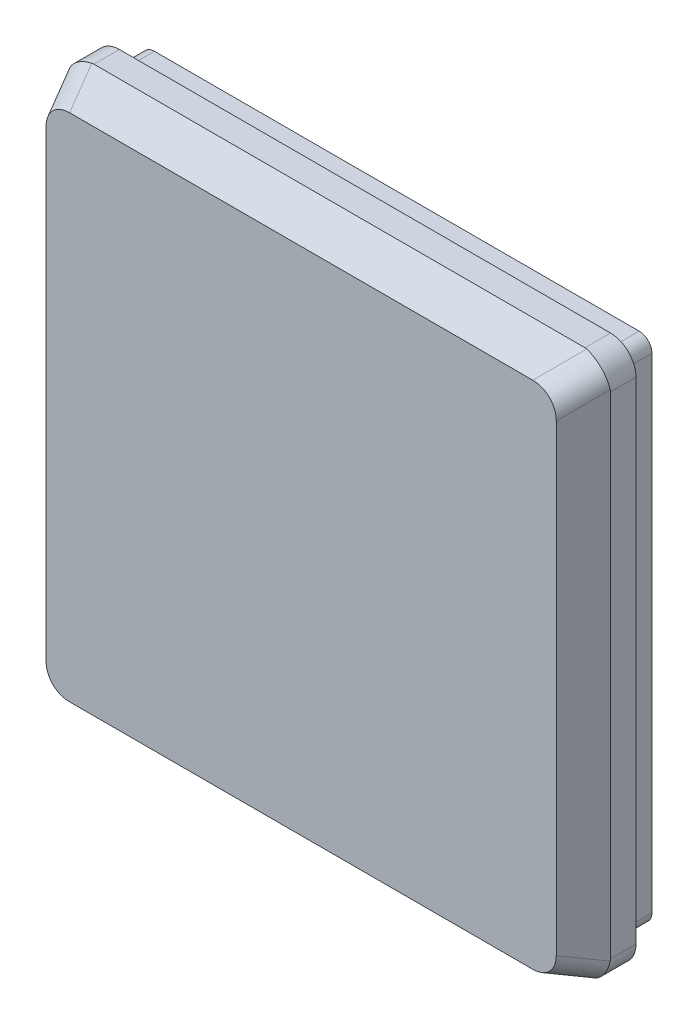
ISO-10303-21;
HEADER;
FILE_DESCRIPTION(('STEP AP214'),'2;1');
FILE_NAME('part.step','',(''),(''),'','','');
FILE_SCHEMA(('AUTOMOTIVE_DESIGN { 1 0 10303 214 1 1 1 1 }'));
ENDSEC;
DATA;
#1=APPLICATION_CONTEXT('core data for automotive mechanical design processes');
#2=APPLICATION_PROTOCOL_DEFINITION('international standard','automotive_design',2000,#1);
#3=PRODUCT_CONTEXT('',#1,'mechanical');
#4=PRODUCT('Part','Part','',(#3));
#5=PRODUCT_RELATED_PRODUCT_CATEGORY('part','',(#4));
#6=PRODUCT_DEFINITION_FORMATION('','',#4);
#7=PRODUCT_DEFINITION_CONTEXT('part definition',#1,'design');
#8=PRODUCT_DEFINITION('design','',#6,#7);
#9=PRODUCT_DEFINITION_SHAPE('','',#8);
#10=(LENGTH_UNIT() NAMED_UNIT(*) SI_UNIT(.MILLI.,.METRE.));
#11=(NAMED_UNIT(*) PLANE_ANGLE_UNIT() SI_UNIT($,.RADIAN.));
#12=(NAMED_UNIT(*) SI_UNIT($,.STERADIAN.) SOLID_ANGLE_UNIT());
#13=UNCERTAINTY_MEASURE_WITH_UNIT(LENGTH_MEASURE(1.E-05),#10,'distance_accuracy_value','');
#14=(GEOMETRIC_REPRESENTATION_CONTEXT(3) GLOBAL_UNCERTAINTY_ASSIGNED_CONTEXT((#13)) GLOBAL_UNIT_ASSIGNED_CONTEXT((#10,
#11,#12)) REPRESENTATION_CONTEXT('',''));
#15=CARTESIAN_POINT('',(0.,0.,0.));
#16=DIRECTION('',(0.,0.,1.));
#17=DIRECTION('',(1.,0.,0.));
#18=AXIS2_PLACEMENT_3D('',#15,#16,#17);
#19=CARTESIAN_POINT('',(80.,-80.,10.));
#20=DIRECTION('',(-1.,0.,0.));
#21=DIRECTION('',(0.,0.,1.));
#22=AXIS2_PLACEMENT_3D('',#19,#20,#21);
#23=PLANE('',#22);
#24=DIRECTION('',(0.,1.,0.));
#25=VECTOR('',#24,1.);
#26=CARTESIAN_POINT('',(80.,-80.,0.));
#27=LINE('',#26,#25);
#28=CARTESIAN_POINT('',(80.,-76.,0.));
#29=VERTEX_POINT('',#28);
#30=CARTESIAN_POINT('',(80.,76.,0.));
#31=VERTEX_POINT('',#30);
#32=EDGE_CURVE('E355',#29,#31,#27,.T.);
#33=ORIENTED_EDGE('',*,*,#32,.T.);
#34=DIRECTION('',(0.,0.,-1.));
#35=VECTOR('',#34,1.);
#36=CARTESIAN_POINT('',(80.,76.,10.));
#37=LINE('',#36,#35);
#38=CARTESIAN_POINT('',(80.,76.,10.));
#39=VERTEX_POINT('',#38);
#40=EDGE_CURVE('E312',#31,#39,#37,.F.);
#41=ORIENTED_EDGE('',*,*,#40,.T.);
#42=DIRECTION('',(0.,1.,0.));
#43=VECTOR('',#42,1.);
#44=CARTESIAN_POINT('',(80.,-80.,10.));
#45=LINE('',#44,#43);
#46=CARTESIAN_POINT('',(80.,-76.,10.));
#47=VERTEX_POINT('',#46);
#48=EDGE_CURVE('E352',#47,#39,#45,.T.);
#49=ORIENTED_EDGE('',*,*,#48,.F.);
#50=DIRECTION('',(0.,0.,-1.));
#51=VECTOR('',#50,1.);
#52=CARTESIAN_POINT('',(80.,-76.,10.));
#53=LINE('',#52,#51);
#54=EDGE_CURVE('E309',#47,#29,#53,.T.);
#55=ORIENTED_EDGE('',*,*,#54,.T.);
#56=EDGE_LOOP('',(#33,#41,#49,#55));
#57=FACE_BOUND('',#56,.T.);
#58=ADVANCED_FACE('F36',(#57),#23,.F.);
#59=CARTESIAN_POINT('',(-80.,80.,10.));
#60=DIRECTION('',(0.,-1.,0.));
#61=DIRECTION('',(0.,0.,-1.));
#62=AXIS2_PLACEMENT_3D('',#59,#60,#61);
#63=PLANE('',#62);
#64=DIRECTION('',(-1.,0.,0.));
#65=VECTOR('',#64,1.);
#66=CARTESIAN_POINT('',(-80.,80.,10.));
#67=LINE('',#66,#65);
#68=CARTESIAN_POINT('',(76.,80.,10.));
#69=VERTEX_POINT('',#68);
#70=CARTESIAN_POINT('',(-76.,80.,10.));
#71=VERTEX_POINT('',#70);
#72=EDGE_CURVE('E406',#69,#71,#67,.T.);
#73=ORIENTED_EDGE('',*,*,#72,.F.);
#74=DIRECTION('',(0.,0.,-1.));
#75=VECTOR('',#74,1.);
#76=CARTESIAN_POINT('',(76.,80.,10.));
#77=LINE('',#76,#75);
#78=CARTESIAN_POINT('',(76.,80.,0.));
#79=VERTEX_POINT('',#78);
#80=EDGE_CURVE('E298',#69,#79,#77,.T.);
#81=ORIENTED_EDGE('',*,*,#80,.T.);
#82=DIRECTION('',(-1.,0.,0.));
#83=VECTOR('',#82,1.);
#84=CARTESIAN_POINT('',(-80.,80.,0.));
#85=LINE('',#84,#83);
#86=CARTESIAN_POINT('',(-76.,80.,0.));
#87=VERTEX_POINT('',#86);
#88=EDGE_CURVE('E350',#79,#87,#85,.T.);
#89=ORIENTED_EDGE('',*,*,#88,.T.);
#90=DIRECTION('',(0.,0.,-1.));
#91=VECTOR('',#90,1.);
#92=CARTESIAN_POINT('',(-76.,80.,10.));
#93=LINE('',#92,#91);
#94=EDGE_CURVE('E287',#87,#71,#93,.F.);
#95=ORIENTED_EDGE('',*,*,#94,.T.);
#96=EDGE_LOOP('',(#73,#81,#89,#95));
#97=FACE_BOUND('',#96,.T.);
#98=ADVANCED_FACE('F420',(#97),#63,.F.);
#99=CARTESIAN_POINT('',(-80.,-80.,10.));
#100=DIRECTION('',(1.,0.,0.));
#101=DIRECTION('',(0.,0.,-1.));
#102=AXIS2_PLACEMENT_3D('',#99,#100,#101);
#103=PLANE('',#102);
#104=DIRECTION('',(0.,-1.,0.));
#105=VECTOR('',#104,1.);
#106=CARTESIAN_POINT('',(-80.,-80.,0.));
#107=LINE('',#106,#105);
#108=CARTESIAN_POINT('',(-80.,76.,0.));
#109=VERTEX_POINT('',#108);
#110=CARTESIAN_POINT('',(-80.,-76.,0.));
#111=VERTEX_POINT('',#110);
#112=EDGE_CURVE('E346',#109,#111,#107,.T.);
#113=ORIENTED_EDGE('',*,*,#112,.T.);
#114=DIRECTION('',(0.,0.,-1.));
#115=VECTOR('',#114,1.);
#116=CARTESIAN_POINT('',(-80.,-76.,10.));
#117=LINE('',#116,#115);
#118=CARTESIAN_POINT('',(-80.,-76.,10.));
#119=VERTEX_POINT('',#118);
#120=EDGE_CURVE('E51',#111,#119,#117,.F.);
#121=ORIENTED_EDGE('',*,*,#120,.T.);
#122=DIRECTION('',(0.,-1.,0.));
#123=VECTOR('',#122,1.);
#124=CARTESIAN_POINT('',(-80.,-80.,10.));
#125=LINE('',#124,#123);
#126=CARTESIAN_POINT('',(-80.,76.,10.));
#127=VERTEX_POINT('',#126);
#128=EDGE_CURVE('E332',#127,#119,#125,.T.);
#129=ORIENTED_EDGE('',*,*,#128,.F.);
#130=DIRECTION('',(0.,0.,-1.));
#131=VECTOR('',#130,1.);
#132=CARTESIAN_POINT('',(-80.,76.,10.));
#133=LINE('',#132,#131);
#134=EDGE_CURVE('E319',#127,#109,#133,.T.);
#135=ORIENTED_EDGE('',*,*,#134,.T.);
#136=EDGE_LOOP('',(#113,#121,#129,#135));
#137=FACE_BOUND('',#136,.T.);
#138=ADVANCED_FACE('F348',(#137),#103,.F.);
#139=CARTESIAN_POINT('',(-80.,-80.,10.));
#140=DIRECTION('',(0.,1.,0.));
#141=DIRECTION('',(0.,0.,1.));
#142=AXIS2_PLACEMENT_3D('',#139,#140,#141);
#143=PLANE('',#142);
#144=DIRECTION('',(1.,0.,0.));
#145=VECTOR('',#144,1.);
#146=CARTESIAN_POINT('',(-80.,-80.,0.));
#147=LINE('',#146,#145);
#148=CARTESIAN_POINT('',(-76.,-80.,0.));
#149=VERTEX_POINT('',#148);
#150=CARTESIAN_POINT('',(76.,-80.,0.));
#151=VERTEX_POINT('',#150);
#152=EDGE_CURVE('E347',#149,#151,#147,.T.);
#153=ORIENTED_EDGE('',*,*,#152,.T.);
#154=DIRECTION('',(0.,0.,-1.));
#155=VECTOR('',#154,1.);
#156=CARTESIAN_POINT('',(76.,-80.,10.));
#157=LINE('',#156,#155);
#158=CARTESIAN_POINT('',(76.,-80.,10.));
#159=VERTEX_POINT('',#158);
#160=EDGE_CURVE('E317',#151,#159,#157,.F.);
#161=ORIENTED_EDGE('',*,*,#160,.T.);
#162=DIRECTION('',(1.,0.,0.));
#163=VECTOR('',#162,1.);
#164=CARTESIAN_POINT('',(-80.,-80.,10.));
#165=LINE('',#164,#163);
#166=CARTESIAN_POINT('',(-76.,-80.,10.));
#167=VERTEX_POINT('',#166);
#168=EDGE_CURVE('E217',#167,#159,#165,.T.);
#169=ORIENTED_EDGE('',*,*,#168,.F.);
#170=DIRECTION('',(0.,0.,-1.));
#171=VECTOR('',#170,1.);
#172=CARTESIAN_POINT('',(-76.,-80.,10.));
#173=LINE('',#172,#171);
#174=EDGE_CURVE('E314',#167,#149,#173,.T.);
#175=ORIENTED_EDGE('',*,*,#174,.T.);
#176=EDGE_LOOP('',(#153,#161,#169,#175));
#177=FACE_BOUND('',#176,.T.);
#178=ADVANCED_FACE('F337',(#177),#143,.F.);
#179=CARTESIAN_POINT('',(0.,0.,0.));
#180=DIRECTION('',(0.,0.,-1.));
#181=DIRECTION('',(-1.,0.,0.));
#182=AXIS2_PLACEMENT_3D('',#179,#180,#181);
#183=PLANE('',#182);
#184=ORIENTED_EDGE('',*,*,#88,.F.);
#185=CARTESIAN_POINT('',(76.,76.,0.));
#186=DIRECTION('',(0.,0.,-1.));
#187=DIRECTION('',(-1.,0.,0.));
#188=AXIS2_PLACEMENT_3D('',#185,#186,#187);
#189=CIRCLE('',#188,4.);
#190=EDGE_CURVE('E307',#79,#31,#189,.T.);
#191=ORIENTED_EDGE('',*,*,#190,.T.);
#192=ORIENTED_EDGE('',*,*,#32,.F.);
#193=CARTESIAN_POINT('',(76.,-76.,0.));
#194=DIRECTION('',(0.,0.,-1.));
#195=DIRECTION('',(-1.,0.,0.));
#196=AXIS2_PLACEMENT_3D('',#193,#194,#195);
#197=CIRCLE('',#196,4.);
#198=EDGE_CURVE('E305',#29,#151,#197,.T.);
#199=ORIENTED_EDGE('',*,*,#198,.T.);
#200=ORIENTED_EDGE('',*,*,#152,.F.);
#201=CARTESIAN_POINT('',(-76.,-76.,0.));
#202=DIRECTION('',(0.,0.,-1.));
#203=DIRECTION('',(-1.,0.,0.));
#204=AXIS2_PLACEMENT_3D('',#201,#202,#203);
#205=CIRCLE('',#204,4.);
#206=EDGE_CURVE('E303',#149,#111,#205,.T.);
#207=ORIENTED_EDGE('',*,*,#206,.T.);
#208=ORIENTED_EDGE('',*,*,#112,.F.);
#209=CARTESIAN_POINT('',(-76.,76.,0.));
#210=DIRECTION('',(0.,0.,-1.));
#211=DIRECTION('',(-1.,0.,0.));
#212=AXIS2_PLACEMENT_3D('',#209,#210,#211);
#213=CIRCLE('',#212,4.);
#214=EDGE_CURVE('E301',#109,#87,#213,.T.);
#215=ORIENTED_EDGE('',*,*,#214,.T.);
#216=EDGE_LOOP('',(#184,#191,#192,#199,#200,#207,#208,#215));
#217=FACE_BOUND('',#216,.T.);
#218=ADVANCED_FACE('F345',(#217),#183,.T.);
#219=CARTESIAN_POINT('',(85.,-85.,30.));
#220=DIRECTION('',(-1.,0.,0.));
#221=DIRECTION('',(0.,0.,1.));
#222=AXIS2_PLACEMENT_3D('',#219,#220,#221);
#223=PLANE('',#222);
#224=DIRECTION('',(0.,-1.,0.));
#225=VECTOR('',#224,1.);
#226=CARTESIAN_POINT('',(85.,-85.,17.9999999999999));
#227=LINE('',#226,#225);
#228=CARTESIAN_POINT('',(85.,77.,17.9999999999999));
#229=VERTEX_POINT('',#228);
#230=CARTESIAN_POINT('',(85.,-77.,17.9999999999999));
#231=VERTEX_POINT('',#230);
#232=EDGE_CURVE('E365',#229,#231,#227,.T.);
#233=ORIENTED_EDGE('',*,*,#232,.T.);
#234=DIRECTION('',(0.,0.,-1.));
#235=VECTOR('',#234,1.);
#236=CARTESIAN_POINT('',(85.,-77.,30.));
#237=LINE('',#236,#235);
#238=CARTESIAN_POINT('',(85.,-77.,10.));
#239=VERTEX_POINT('',#238);
#240=EDGE_CURVE('E265',#231,#239,#237,.T.);
#241=ORIENTED_EDGE('',*,*,#240,.T.);
#242=DIRECTION('',(0.,1.,0.));
#243=VECTOR('',#242,1.);
#244=CARTESIAN_POINT('',(85.,-85.,10.));
#245=LINE('',#244,#243);
#246=CARTESIAN_POINT('',(85.,77.,10.));
#247=VERTEX_POINT('',#246);
#248=EDGE_CURVE('E291',#239,#247,#245,.T.);
#249=ORIENTED_EDGE('',*,*,#248,.T.);
#250=DIRECTION('',(0.,0.,-1.));
#251=VECTOR('',#250,1.);
#252=CARTESIAN_POINT('',(85.,77.,30.));
#253=LINE('',#252,#251);
#254=EDGE_CURVE('E263',#247,#229,#253,.F.);
#255=ORIENTED_EDGE('',*,*,#254,.T.);
#256=EDGE_LOOP('',(#233,#241,#249,#255));
#257=FACE_BOUND('',#256,.T.);
#258=ADVANCED_FACE('F392',(#257),#223,.F.);
#259=CARTESIAN_POINT('',(-85.,85.,30.));
#260=DIRECTION('',(0.,-1.,0.));
#261=DIRECTION('',(0.,0.,-1.));
#262=AXIS2_PLACEMENT_3D('',#259,#260,#261);
#263=PLANE('',#262);
#264=DIRECTION('',(-1.,0.,0.));
#265=VECTOR('',#264,1.);
#266=CARTESIAN_POINT('',(-85.,85.,10.));
#267=LINE('',#266,#265);
#268=CARTESIAN_POINT('',(77.,85.,10.));
#269=VERTEX_POINT('',#268);
#270=CARTESIAN_POINT('',(-77.,85.,10.));
#271=VERTEX_POINT('',#270);
#272=EDGE_CURVE('E390',#269,#271,#267,.T.);
#273=ORIENTED_EDGE('',*,*,#272,.T.);
#274=DIRECTION('',(0.,0.,-1.));
#275=VECTOR('',#274,1.);
#276=CARTESIAN_POINT('',(-77.,85.,30.));
#277=LINE('',#276,#275);
#278=CARTESIAN_POINT('',(-77.,85.,17.9999999999999));
#279=VERTEX_POINT('',#278);
#280=EDGE_CURVE('E285',#271,#279,#277,.F.);
#281=ORIENTED_EDGE('',*,*,#280,.T.);
#282=DIRECTION('',(1.,0.,0.));
#283=VECTOR('',#282,1.);
#284=CARTESIAN_POINT('',(-85.,85.,17.9999999999999));
#285=LINE('',#284,#283);
#286=CARTESIAN_POINT('',(77.,85.,17.9999999999999));
#287=VERTEX_POINT('',#286);
#288=EDGE_CURVE('E227',#279,#287,#285,.T.);
#289=ORIENTED_EDGE('',*,*,#288,.T.);
#290=DIRECTION('',(0.,0.,-1.));
#291=VECTOR('',#290,1.);
#292=CARTESIAN_POINT('',(77.,85.,30.));
#293=LINE('',#292,#291);
#294=EDGE_CURVE('E283',#287,#269,#293,.T.);
#295=ORIENTED_EDGE('',*,*,#294,.T.);
#296=EDGE_LOOP('',(#273,#281,#289,#295));
#297=FACE_BOUND('',#296,.T.);
#298=ADVANCED_FACE('F378',(#297),#263,.F.);
#299=CARTESIAN_POINT('',(-85.,-85.,30.));
#300=DIRECTION('',(1.,0.,0.));
#301=DIRECTION('',(0.,0.,-1.));
#302=AXIS2_PLACEMENT_3D('',#299,#300,#301);
#303=PLANE('',#302);
#304=DIRECTION('',(0.,-1.,0.));
#305=VECTOR('',#304,1.);
#306=CARTESIAN_POINT('',(-85.,-85.,10.));
#307=LINE('',#306,#305);
#308=CARTESIAN_POINT('',(-85.,77.,10.));
#309=VERTEX_POINT('',#308);
#310=CARTESIAN_POINT('',(-85.,-77.,10.));
#311=VERTEX_POINT('',#310);
#312=EDGE_CURVE('E396',#309,#311,#307,.T.);
#313=ORIENTED_EDGE('',*,*,#312,.T.);
#314=DIRECTION('',(0.,0.,-1.));
#315=VECTOR('',#314,1.);
#316=CARTESIAN_POINT('',(-85.,-77.,30.));
#317=LINE('',#316,#315);
#318=CARTESIAN_POINT('',(-85.,-77.,17.9999999999999));
#319=VERTEX_POINT('',#318);
#320=EDGE_CURVE('E281',#311,#319,#317,.F.);
#321=ORIENTED_EDGE('',*,*,#320,.T.);
#322=DIRECTION('',(0.,1.,0.));
#323=VECTOR('',#322,1.);
#324=CARTESIAN_POINT('',(-85.,-85.,17.9999999999999));
#325=LINE('',#324,#323);
#326=CARTESIAN_POINT('',(-85.,77.,17.9999999999999));
#327=VERTEX_POINT('',#326);
#328=EDGE_CURVE('E371',#319,#327,#325,.T.);
#329=ORIENTED_EDGE('',*,*,#328,.T.);
#330=DIRECTION('',(0.,0.,-1.));
#331=VECTOR('',#330,1.);
#332=CARTESIAN_POINT('',(-85.,77.,30.));
#333=LINE('',#332,#331);
#334=EDGE_CURVE('E279',#327,#309,#333,.T.);
#335=ORIENTED_EDGE('',*,*,#334,.T.);
#336=EDGE_LOOP('',(#313,#321,#329,#335));
#337=FACE_BOUND('',#336,.T.);
#338=ADVANCED_FACE('F598',(#337),#303,.F.);
#339=CARTESIAN_POINT('',(-85.,-85.,30.));
#340=DIRECTION('',(0.,1.,0.));
#341=DIRECTION('',(0.,0.,1.));
#342=AXIS2_PLACEMENT_3D('',#339,#340,#341);
#343=PLANE('',#342);
#344=DIRECTION('',(1.,0.,0.));
#345=VECTOR('',#344,1.);
#346=CARTESIAN_POINT('',(-85.,-85.,10.));
#347=LINE('',#346,#345);
#348=CARTESIAN_POINT('',(-77.,-85.,10.));
#349=VERTEX_POINT('',#348);
#350=CARTESIAN_POINT('',(77.,-85.,10.));
#351=VERTEX_POINT('',#350);
#352=EDGE_CURVE('E401',#349,#351,#347,.T.);
#353=ORIENTED_EDGE('',*,*,#352,.T.);
#354=DIRECTION('',(0.,0.,-1.));
#355=VECTOR('',#354,1.);
#356=CARTESIAN_POINT('',(77.,-85.,30.));
#357=LINE('',#356,#355);
#358=CARTESIAN_POINT('',(77.,-85.,17.9999999999999));
#359=VERTEX_POINT('',#358);
#360=EDGE_CURVE('E277',#351,#359,#357,.F.);
#361=ORIENTED_EDGE('',*,*,#360,.T.);
#362=DIRECTION('',(-1.,0.,0.));
#363=VECTOR('',#362,1.);
#364=CARTESIAN_POINT('',(-85.,-85.,17.9999999999999));
#365=LINE('',#364,#363);
#366=CARTESIAN_POINT('',(-77.,-85.,17.9999999999999));
#367=VERTEX_POINT('',#366);
#368=EDGE_CURVE('E368',#359,#367,#365,.T.);
#369=ORIENTED_EDGE('',*,*,#368,.T.);
#370=DIRECTION('',(0.,0.,-1.));
#371=VECTOR('',#370,1.);
#372=CARTESIAN_POINT('',(-77.,-85.,30.));
#373=LINE('',#372,#371);
#374=EDGE_CURVE('E275',#367,#349,#373,.T.);
#375=ORIENTED_EDGE('',*,*,#374,.T.);
#376=EDGE_LOOP('',(#353,#361,#369,#375));
#377=FACE_BOUND('',#376,.T.);
#378=ADVANCED_FACE('F590',(#377),#343,.F.);
#379=CARTESIAN_POINT('',(0.,0.,30.));
#380=DIRECTION('',(0.,0.,-1.));
#381=DIRECTION('',(-1.,0.,0.));
#382=AXIS2_PLACEMENT_3D('',#379,#380,#381);
#383=PLANE('',#382);
#384=DIRECTION('',(-1.,0.,0.));
#385=VECTOR('',#384,1.);
#386=CARTESIAN_POINT('',(0.,80.,30.));
#387=LINE('',#386,#385);
#388=CARTESIAN_POINT('',(72.6153846153846,80.,30.));
#389=VERTEX_POINT('',#388);
#390=CARTESIAN_POINT('',(-72.6153846153846,80.,30.));
#391=VERTEX_POINT('',#390);
#392=EDGE_CURVE('E200',#389,#391,#387,.T.);
#393=ORIENTED_EDGE('',*,*,#392,.T.);
#394=CARTESIAN_POINT('',(-71.3333333333333,71.3333333333334,30.));
#395=DIRECTION('',(0.,0.,-1.));
#396=DIRECTION('',(0.707106781186548,-0.707106781186548,0.));
#397=AXIS2_PLACEMENT_3D('',#394,#395,#396);
#398=ELLIPSE('',#397,9.2855921847894,8.);
#399=CARTESIAN_POINT('',(-80.,72.6153846153846,30.));
#400=VERTEX_POINT('',#399);
#401=EDGE_CURVE('E235',#391,#400,#398,.F.);
#402=ORIENTED_EDGE('',*,*,#401,.T.);
#403=DIRECTION('',(0.,-1.,0.));
#404=VECTOR('',#403,1.);
#405=CARTESIAN_POINT('',(-80.,0.,30.));
#406=LINE('',#405,#404);
#407=CARTESIAN_POINT('',(-80.,-72.6153846153846,30.));
#408=VERTEX_POINT('',#407);
#409=EDGE_CURVE('E216',#400,#408,#406,.T.);
#410=ORIENTED_EDGE('',*,*,#409,.T.);
#411=CARTESIAN_POINT('',(-71.3333333333333,-71.3333333333334,30.));
#412=DIRECTION('',(0.,0.,-1.));
#413=DIRECTION('',(-0.707106781186548,-0.707106781186548,0.));
#414=AXIS2_PLACEMENT_3D('',#411,#412,#413);
#415=ELLIPSE('',#414,9.2855921847894,8.);
#416=CARTESIAN_POINT('',(-72.6153846153846,-80.,30.));
#417=VERTEX_POINT('',#416);
#418=EDGE_CURVE('E233',#408,#417,#415,.F.);
#419=ORIENTED_EDGE('',*,*,#418,.T.);
#420=DIRECTION('',(1.,0.,0.));
#421=VECTOR('',#420,1.);
#422=CARTESIAN_POINT('',(0.,-80.,30.));
#423=LINE('',#422,#421);
#424=CARTESIAN_POINT('',(72.6153846153846,-80.,30.));
#425=VERTEX_POINT('',#424);
#426=EDGE_CURVE('E361',#417,#425,#423,.T.);
#427=ORIENTED_EDGE('',*,*,#426,.T.);
#428=CARTESIAN_POINT('',(71.3333333333333,-71.3333333333333,30.));
#429=DIRECTION('',(0.,0.,-1.));
#430=DIRECTION('',(0.707106781186548,-0.707106781186548,0.));
#431=AXIS2_PLACEMENT_3D('',#428,#429,#430);
#432=ELLIPSE('',#431,9.2855921847894,8.);
#433=CARTESIAN_POINT('',(80.,-72.6153846153846,30.));
#434=VERTEX_POINT('',#433);
#435=EDGE_CURVE('E207',#425,#434,#432,.F.);
#436=ORIENTED_EDGE('',*,*,#435,.T.);
#437=DIRECTION('',(0.,1.,0.));
#438=VECTOR('',#437,1.);
#439=CARTESIAN_POINT('',(80.,0.,30.));
#440=LINE('',#439,#438);
#441=CARTESIAN_POINT('',(80.,72.6153846153846,30.));
#442=VERTEX_POINT('',#441);
#443=EDGE_CURVE('E202',#434,#442,#440,.T.);
#444=ORIENTED_EDGE('',*,*,#443,.T.);
#445=CARTESIAN_POINT('',(71.3333333333333,71.3333333333333,30.));
#446=DIRECTION('',(0.,0.,-1.));
#447=DIRECTION('',(-0.707106781186548,-0.707106781186548,0.));
#448=AXIS2_PLACEMENT_3D('',#445,#446,#447);
#449=ELLIPSE('',#448,9.2855921847894,8.);
#450=EDGE_CURVE('E197',#442,#389,#449,.F.);
#451=ORIENTED_EDGE('',*,*,#450,.T.);
#452=EDGE_LOOP('',(#393,#402,#410,#419,#427,#436,#444,#451));
#453=FACE_BOUND('',#452,.T.);
#454=ADVANCED_FACE('F199',(#453),#383,.F.);
#455=CARTESIAN_POINT('',(0.,0.,10.));
#456=DIRECTION('',(0.,0.,-1.));
#457=DIRECTION('',(-1.,0.,0.));
#458=AXIS2_PLACEMENT_3D('',#455,#456,#457);
#459=PLANE('',#458);
#460=ORIENTED_EDGE('',*,*,#128,.T.);
#461=CARTESIAN_POINT('',(-76.,-76.,10.));
#462=DIRECTION('',(0.,0.,-1.));
#463=DIRECTION('',(-1.,0.,0.));
#464=AXIS2_PLACEMENT_3D('',#461,#462,#463);
#465=CIRCLE('',#464,4.);
#466=EDGE_CURVE('E44',#119,#167,#465,.F.);
#467=ORIENTED_EDGE('',*,*,#466,.T.);
#468=ORIENTED_EDGE('',*,*,#168,.T.);
#469=CARTESIAN_POINT('',(76.,-76.,10.));
#470=DIRECTION('',(0.,0.,-1.));
#471=DIRECTION('',(-1.,0.,0.));
#472=AXIS2_PLACEMENT_3D('',#469,#470,#471);
#473=CIRCLE('',#472,4.);
#474=EDGE_CURVE('E325',#159,#47,#473,.F.);
#475=ORIENTED_EDGE('',*,*,#474,.T.);
#476=ORIENTED_EDGE('',*,*,#48,.T.);
#477=CARTESIAN_POINT('',(76.,76.,10.));
#478=DIRECTION('',(0.,0.,-1.));
#479=DIRECTION('',(-1.,0.,0.));
#480=AXIS2_PLACEMENT_3D('',#477,#478,#479);
#481=CIRCLE('',#480,4.);
#482=EDGE_CURVE('E323',#39,#69,#481,.F.);
#483=ORIENTED_EDGE('',*,*,#482,.T.);
#484=ORIENTED_EDGE('',*,*,#72,.T.);
#485=CARTESIAN_POINT('',(-76.,76.,10.));
#486=DIRECTION('',(0.,0.,-1.));
#487=DIRECTION('',(-1.,0.,0.));
#488=AXIS2_PLACEMENT_3D('',#485,#486,#487);
#489=CIRCLE('',#488,4.);
#490=EDGE_CURVE('E11',#71,#127,#489,.F.);
#491=ORIENTED_EDGE('',*,*,#490,.T.);
#492=EDGE_LOOP('',(#460,#467,#468,#475,#476,#483,#484,#491));
#493=FACE_BOUND('',#492,.T.);
#494=ORIENTED_EDGE('',*,*,#248,.F.);
#495=CARTESIAN_POINT('',(77.,-77.,10.));
#496=DIRECTION('',(0.,0.,-1.));
#497=DIRECTION('',(-1.,0.,0.));
#498=AXIS2_PLACEMENT_3D('',#495,#496,#497);
#499=CIRCLE('',#498,8.);
#500=EDGE_CURVE('E273',#239,#351,#499,.T.);
#501=ORIENTED_EDGE('',*,*,#500,.T.);
#502=ORIENTED_EDGE('',*,*,#352,.F.);
#503=CARTESIAN_POINT('',(-77.,-77.,10.));
#504=DIRECTION('',(0.,0.,-1.));
#505=DIRECTION('',(-1.,0.,0.));
#506=AXIS2_PLACEMENT_3D('',#503,#504,#505);
#507=CIRCLE('',#506,8.);
#508=EDGE_CURVE('E271',#349,#311,#507,.T.);
#509=ORIENTED_EDGE('',*,*,#508,.T.);
#510=ORIENTED_EDGE('',*,*,#312,.F.);
#511=CARTESIAN_POINT('',(-77.,77.,10.));
#512=DIRECTION('',(0.,0.,-1.));
#513=DIRECTION('',(-1.,0.,0.));
#514=AXIS2_PLACEMENT_3D('',#511,#512,#513);
#515=CIRCLE('',#514,8.);
#516=EDGE_CURVE('E269',#309,#271,#515,.T.);
#517=ORIENTED_EDGE('',*,*,#516,.T.);
#518=ORIENTED_EDGE('',*,*,#272,.F.);
#519=CARTESIAN_POINT('',(77.,77.,10.));
#520=DIRECTION('',(0.,0.,-1.));
#521=DIRECTION('',(-1.,0.,0.));
#522=AXIS2_PLACEMENT_3D('',#519,#520,#521);
#523=CIRCLE('',#522,8.);
#524=EDGE_CURVE('E267',#269,#247,#523,.T.);
#525=ORIENTED_EDGE('',*,*,#524,.T.);
#526=EDGE_LOOP('',(#494,#501,#502,#509,#510,#517,#518,#525));
#527=FACE_BOUND('',#526,.T.);
#528=ADVANCED_FACE('F329',(#493,#527),#459,.T.);
#529=CARTESIAN_POINT('',(-80.,0.,30.));
#530=DIRECTION('',(0.923076923076924,0.,-0.384615384615382));
#531=DIRECTION('',(0.,-1.,0.));
#532=AXIS2_PLACEMENT_3D('',#529,#530,#531);
#533=PLANE('',#532);
#534=CARTESIAN_POINT('',(-77.,-77.,37.2000000000001));
#535=DIRECTION('',(0.923076923076924,0.,-0.384615384615382));
#536=DIRECTION('',(-0.384615384615382,0.,-0.923076923076924));
#537=AXIS2_PLACEMENT_3D('',#534,#535,#536);
#538=ELLIPSE('',#537,20.8000000000001,8.);
#539=CARTESIAN_POINT('',(-84.977965623749,-77.5933502391336,18.0528825030024));
#540=VERTEX_POINT('',#539);
#541=EDGE_CURVE('E241',#319,#540,#538,.F.);
#542=ORIENTED_EDGE('',*,*,#541,.T.);
#543=DIRECTION('',(0.358979079308867,0.358979079308867,0.861549790341287));
#544=VECTOR('',#543,1.);
#545=CARTESIAN_POINT('',(-70.6423473433784,-63.257731958763,52.4583663758921));
#546=LINE('',#545,#544);
#547=EDGE_CURVE('E243',#540,#408,#546,.T.);
#548=ORIENTED_EDGE('',*,*,#547,.T.);
#549=ORIENTED_EDGE('',*,*,#409,.F.);
#550=DIRECTION('',(-0.358979079308867,0.358979079308867,-0.861549790341287));
#551=VECTOR('',#550,1.);
#552=CARTESIAN_POINT('',(-70.6423473433784,63.257731958763,52.4583663758921));
#553=LINE('',#552,#551);
#554=CARTESIAN_POINT('',(-84.977965623749,77.5933502391336,18.0528825030024));
#555=VERTEX_POINT('',#554);
#556=EDGE_CURVE('E239',#400,#555,#553,.T.);
#557=ORIENTED_EDGE('',*,*,#556,.T.);
#558=CARTESIAN_POINT('',(-77.,77.,37.2000000000001));
#559=DIRECTION('',(0.923076923076924,0.,-0.384615384615382));
#560=DIRECTION('',(-0.384615384615382,0.,-0.923076923076924));
#561=AXIS2_PLACEMENT_3D('',#558,#559,#560);
#562=ELLIPSE('',#561,20.8000000000001,8.);
#563=EDGE_CURVE('E237',#555,#327,#562,.F.);
#564=ORIENTED_EDGE('',*,*,#563,.T.);
#565=ORIENTED_EDGE('',*,*,#328,.F.);
#566=EDGE_LOOP('',(#542,#548,#549,#557,#564,#565));
#567=FACE_BOUND('',#566,.T.);
#568=ADVANCED_FACE('F456',(#567),#533,.F.);
#569=CARTESIAN_POINT('',(0.,-80.,30.));
#570=DIRECTION('',(0.,0.923076923076924,-0.384615384615382));
#571=DIRECTION('',(1.,0.,0.));
#572=AXIS2_PLACEMENT_3D('',#569,#570,#571);
#573=PLANE('',#572);
#574=CARTESIAN_POINT('',(77.,-77.,37.2000000000001));
#575=DIRECTION('',(0.,0.923076923076924,-0.384615384615382));
#576=DIRECTION('',(0.,-0.384615384615382,-0.923076923076924));
#577=AXIS2_PLACEMENT_3D('',#574,#575,#576);
#578=ELLIPSE('',#577,20.8000000000001,8.);
#579=CARTESIAN_POINT('',(77.5933502391336,-84.977965623749,18.0528825030024));
#580=VERTEX_POINT('',#579);
#581=EDGE_CURVE('E250',#359,#580,#578,.F.);
#582=ORIENTED_EDGE('',*,*,#581,.T.);
#583=DIRECTION('',(-0.358979079308867,0.358979079308867,0.861549790341287));
#584=VECTOR('',#583,1.);
#585=CARTESIAN_POINT('',(63.257731958763,-70.6423473433784,52.4583663758921));
#586=LINE('',#585,#584);
#587=EDGE_CURVE('E252',#580,#425,#586,.T.);
#588=ORIENTED_EDGE('',*,*,#587,.T.);
#589=ORIENTED_EDGE('',*,*,#426,.F.);
#590=DIRECTION('',(0.358979079308867,0.358979079308867,0.861549790341287));
#591=VECTOR('',#590,1.);
#592=CARTESIAN_POINT('',(-63.257731958763,-70.6423473433784,52.4583663758921));
#593=LINE('',#592,#591);
#594=CARTESIAN_POINT('',(-77.5933502391336,-84.977965623749,18.0528825030024));
#595=VERTEX_POINT('',#594);
#596=EDGE_CURVE('E247',#417,#595,#593,.F.);
#597=ORIENTED_EDGE('',*,*,#596,.T.);
#598=CARTESIAN_POINT('',(-77.,-77.,37.2000000000001));
#599=DIRECTION('',(0.,0.923076923076924,-0.384615384615382));
#600=DIRECTION('',(0.,-0.384615384615382,-0.923076923076924));
#601=AXIS2_PLACEMENT_3D('',#598,#599,#600);
#602=ELLIPSE('',#601,20.8000000000001,8.);
#603=EDGE_CURVE('E245',#595,#367,#602,.F.);
#604=ORIENTED_EDGE('',*,*,#603,.T.);
#605=ORIENTED_EDGE('',*,*,#368,.F.);
#606=EDGE_LOOP('',(#582,#588,#589,#597,#604,#605));
#607=FACE_BOUND('',#606,.T.);
#608=ADVANCED_FACE('F450',(#607),#573,.F.);
#609=CARTESIAN_POINT('',(0.,80.,30.));
#610=DIRECTION('',(0.,-0.923076923076924,-0.384615384615382));
#611=DIRECTION('',(-1.,0.,0.));
#612=AXIS2_PLACEMENT_3D('',#609,#610,#611);
#613=PLANE('',#612);
#614=CARTESIAN_POINT('',(-77.,77.,37.2000000000001));
#615=DIRECTION('',(0.,-0.923076923076924,-0.384615384615382));
#616=DIRECTION('',(0.,0.384615384615382,-0.923076923076924));
#617=AXIS2_PLACEMENT_3D('',#614,#615,#616);
#618=ELLIPSE('',#617,20.8000000000001,8.);
#619=CARTESIAN_POINT('',(-77.5933502391336,84.977965623749,18.0528825030024));
#620=VERTEX_POINT('',#619);
#621=EDGE_CURVE('E223',#279,#620,#618,.F.);
#622=ORIENTED_EDGE('',*,*,#621,.T.);
#623=DIRECTION('',(-0.358979079308867,0.358979079308867,-0.861549790341287));
#624=VECTOR('',#623,1.);
#625=CARTESIAN_POINT('',(-63.257731958763,70.6423473433784,52.4583663758921));
#626=LINE('',#625,#624);
#627=EDGE_CURVE('E208',#620,#391,#626,.F.);
#628=ORIENTED_EDGE('',*,*,#627,.T.);
#629=ORIENTED_EDGE('',*,*,#392,.F.);
#630=DIRECTION('',(0.358979079308867,0.358979079308867,-0.861549790341287));
#631=VECTOR('',#630,1.);
#632=CARTESIAN_POINT('',(63.257731958763,70.6423473433784,52.4583663758921));
#633=LINE('',#632,#631);
#634=CARTESIAN_POINT('',(77.5933502391336,84.977965623749,18.0528825030024));
#635=VERTEX_POINT('',#634);
#636=EDGE_CURVE('E213',#389,#635,#633,.T.);
#637=ORIENTED_EDGE('',*,*,#636,.T.);
#638=CARTESIAN_POINT('',(77.,77.,37.2000000000001));
#639=DIRECTION('',(0.,-0.923076923076924,-0.384615384615382));
#640=DIRECTION('',(0.,0.384615384615382,-0.923076923076924));
#641=AXIS2_PLACEMENT_3D('',#638,#639,#640);
#642=ELLIPSE('',#641,20.8000000000001,8.);
#643=EDGE_CURVE('E224',#635,#287,#642,.F.);
#644=ORIENTED_EDGE('',*,*,#643,.T.);
#645=ORIENTED_EDGE('',*,*,#288,.F.);
#646=EDGE_LOOP('',(#622,#628,#629,#637,#644,#645));
#647=FACE_BOUND('',#646,.T.);
#648=ADVANCED_FACE('F212',(#647),#613,.F.);
#649=CARTESIAN_POINT('',(80.,0.,30.));
#650=DIRECTION('',(-0.923076923076924,0.,-0.384615384615382));
#651=DIRECTION('',(0.,1.,0.));
#652=AXIS2_PLACEMENT_3D('',#649,#650,#651);
#653=PLANE('',#652);
#654=ORIENTED_EDGE('',*,*,#443,.F.);
#655=DIRECTION('',(-0.358979079308867,0.358979079308867,0.861549790341287));
#656=VECTOR('',#655,1.);
#657=CARTESIAN_POINT('',(70.6423473433784,-63.257731958763,52.4583663758921));
#658=LINE('',#657,#656);
#659=CARTESIAN_POINT('',(84.977965623749,-77.5933502391336,18.0528825030024));
#660=VERTEX_POINT('',#659);
#661=EDGE_CURVE('E260',#434,#660,#658,.F.);
#662=ORIENTED_EDGE('',*,*,#661,.T.);
#663=CARTESIAN_POINT('',(77.,-77.,37.2));
#664=DIRECTION('',(-0.923076923076924,0.,-0.384615384615382));
#665=DIRECTION('',(0.384615384615382,0.,-0.923076923076924));
#666=AXIS2_PLACEMENT_3D('',#663,#664,#665);
#667=ELLIPSE('',#666,20.8000000000001,8.);
#668=EDGE_CURVE('E258',#660,#231,#667,.F.);
#669=ORIENTED_EDGE('',*,*,#668,.T.);
#670=ORIENTED_EDGE('',*,*,#232,.F.);
#671=CARTESIAN_POINT('',(77.,77.,37.2));
#672=DIRECTION('',(-0.923076923076924,0.,-0.384615384615382));
#673=DIRECTION('',(0.384615384615382,0.,-0.923076923076924));
#674=AXIS2_PLACEMENT_3D('',#671,#672,#673);
#675=ELLIPSE('',#674,20.8000000000001,8.);
#676=CARTESIAN_POINT('',(84.977965623749,77.5933502391336,18.0528825030024));
#677=VERTEX_POINT('',#676);
#678=EDGE_CURVE('E254',#229,#677,#675,.F.);
#679=ORIENTED_EDGE('',*,*,#678,.T.);
#680=DIRECTION('',(0.358979079308867,0.358979079308867,-0.861549790341287));
#681=VECTOR('',#680,1.);
#682=CARTESIAN_POINT('',(70.6423473433784,63.257731958763,52.4583663758921));
#683=LINE('',#682,#681);
#684=EDGE_CURVE('E256',#677,#442,#683,.F.);
#685=ORIENTED_EDGE('',*,*,#684,.T.);
#686=EDGE_LOOP('',(#654,#662,#669,#670,#679,#685));
#687=FACE_BOUND('',#686,.T.);
#688=ADVANCED_FACE('F437',(#687),#653,.F.);
#689=CARTESIAN_POINT('',(-77.,77.,30.));
#690=DIRECTION('',(0.,0.,-1.));
#691=DIRECTION('',(-1.,0.,0.));
#692=AXIS2_PLACEMENT_3D('',#689,#690,#691);
#693=CYLINDRICAL_SURFACE('',#692,8.);
#694=ORIENTED_EDGE('',*,*,#334,.F.);
#695=ORIENTED_EDGE('',*,*,#563,.F.);
#696=CARTESIAN_POINT('',(-77.,77.,16.3999999999999));
#697=DIRECTION('',(-0.186044490417422,0.186044490417422,-0.964766756874761));
#698=DIRECTION('',(0.682193116049497,-0.682193116049497,-0.263106641553109));
#699=AXIS2_PLACEMENT_3D('',#696,#697,#698);
#700=ELLIPSE('',#699,8.29215967796712,8.);
#701=EDGE_CURVE('E288',#620,#555,#700,.F.);
#702=ORIENTED_EDGE('',*,*,#701,.F.);
#703=ORIENTED_EDGE('',*,*,#621,.F.);
#704=ORIENTED_EDGE('',*,*,#280,.F.);
#705=ORIENTED_EDGE('',*,*,#516,.F.);
#706=EDGE_LOOP('',(#694,#695,#702,#703,#704,#705));
#707=FACE_BOUND('',#706,.T.);
#708=ADVANCED_FACE('F443',(#707),#693,.T.);
#709=CARTESIAN_POINT('',(-63.257731958763,63.257731958763,49.381443298969));
#710=DIRECTION('',(0.358979079308867,-0.358979079308867,0.861549790341287));
#711=DIRECTION('',(0.923076923076924,0.,-0.384615384615382));
#712=AXIS2_PLACEMENT_3D('',#709,#710,#711);
#713=CYLINDRICAL_SURFACE('',#712,8.);
#714=ORIENTED_EDGE('',*,*,#701,.T.);
#715=ORIENTED_EDGE('',*,*,#556,.F.);
#716=ORIENTED_EDGE('',*,*,#401,.F.);
#717=ORIENTED_EDGE('',*,*,#627,.F.);
#718=EDGE_LOOP('',(#714,#715,#716,#717));
#719=FACE_BOUND('',#718,.T.);
#720=ADVANCED_FACE('F463',(#719),#713,.T.);
#721=CARTESIAN_POINT('',(-77.,-77.,30.));
#722=DIRECTION('',(0.,0.,-1.));
#723=DIRECTION('',(-1.,0.,0.));
#724=AXIS2_PLACEMENT_3D('',#721,#722,#723);
#725=CYLINDRICAL_SURFACE('',#724,8.);
#726=ORIENTED_EDGE('',*,*,#374,.F.);
#727=ORIENTED_EDGE('',*,*,#603,.F.);
#728=CARTESIAN_POINT('',(-77.,-77.,16.3999999999999));
#729=DIRECTION('',(-0.186044490417422,-0.186044490417422,-0.964766756874761));
#730=DIRECTION('',(0.682193116049497,0.682193116049497,-0.263106641553109));
#731=AXIS2_PLACEMENT_3D('',#728,#729,#730);
#732=ELLIPSE('',#731,8.29215967796712,8.);
#733=EDGE_CURVE('E292',#540,#595,#732,.F.);
#734=ORIENTED_EDGE('',*,*,#733,.F.);
#735=ORIENTED_EDGE('',*,*,#541,.F.);
#736=ORIENTED_EDGE('',*,*,#320,.F.);
#737=ORIENTED_EDGE('',*,*,#508,.F.);
#738=EDGE_LOOP('',(#726,#727,#734,#735,#736,#737));
#739=FACE_BOUND('',#738,.T.);
#740=ADVANCED_FACE('F466',(#739),#725,.T.);
#741=CARTESIAN_POINT('',(-63.257731958763,-63.257731958763,49.381443298969));
#742=DIRECTION('',(-0.358979079308867,-0.358979079308867,-0.861549790341287));
#743=DIRECTION('',(-0.923076923076924,0.,0.384615384615382));
#744=AXIS2_PLACEMENT_3D('',#741,#742,#743);
#745=CYLINDRICAL_SURFACE('',#744,8.);
#746=ORIENTED_EDGE('',*,*,#418,.F.);
#747=ORIENTED_EDGE('',*,*,#547,.F.);
#748=ORIENTED_EDGE('',*,*,#733,.T.);
#749=ORIENTED_EDGE('',*,*,#596,.F.);
#750=EDGE_LOOP('',(#746,#747,#748,#749));
#751=FACE_BOUND('',#750,.T.);
#752=ADVANCED_FACE('F471',(#751),#745,.T.);
#753=CARTESIAN_POINT('',(77.,-77.,30.));
#754=DIRECTION('',(0.,0.,-1.));
#755=DIRECTION('',(-1.,0.,0.));
#756=AXIS2_PLACEMENT_3D('',#753,#754,#755);
#757=CYLINDRICAL_SURFACE('',#756,8.);
#758=ORIENTED_EDGE('',*,*,#240,.F.);
#759=ORIENTED_EDGE('',*,*,#668,.F.);
#760=CARTESIAN_POINT('',(77.,-77.,16.3999999999999));
#761=DIRECTION('',(0.186044490417422,-0.186044490417422,-0.964766756874761));
#762=DIRECTION('',(-0.682193116049497,0.682193116049497,-0.263106641553109));
#763=AXIS2_PLACEMENT_3D('',#760,#761,#762);
#764=ELLIPSE('',#763,8.29215967796712,8.);
#765=EDGE_CURVE('E294',#580,#660,#764,.F.);
#766=ORIENTED_EDGE('',*,*,#765,.F.);
#767=ORIENTED_EDGE('',*,*,#581,.F.);
#768=ORIENTED_EDGE('',*,*,#360,.F.);
#769=ORIENTED_EDGE('',*,*,#500,.F.);
#770=EDGE_LOOP('',(#758,#759,#766,#767,#768,#769));
#771=FACE_BOUND('',#770,.T.);
#772=ADVANCED_FACE('F474',(#771),#757,.T.);
#773=CARTESIAN_POINT('',(63.257731958763,-63.257731958763,49.381443298969));
#774=DIRECTION('',(0.358979079308867,-0.358979079308867,-0.861549790341287));
#775=DIRECTION('',(-0.923076923076924,0.,-0.384615384615382));
#776=AXIS2_PLACEMENT_3D('',#773,#774,#775);
#777=CYLINDRICAL_SURFACE('',#776,8.);
#778=ORIENTED_EDGE('',*,*,#435,.F.);
#779=ORIENTED_EDGE('',*,*,#587,.F.);
#780=ORIENTED_EDGE('',*,*,#765,.T.);
#781=ORIENTED_EDGE('',*,*,#661,.F.);
#782=EDGE_LOOP('',(#778,#779,#780,#781));
#783=FACE_BOUND('',#782,.T.);
#784=ADVANCED_FACE('F479',(#783),#777,.T.);
#785=CARTESIAN_POINT('',(77.,77.,30.));
#786=DIRECTION('',(0.,0.,-1.));
#787=DIRECTION('',(-1.,0.,0.));
#788=AXIS2_PLACEMENT_3D('',#785,#786,#787);
#789=CYLINDRICAL_SURFACE('',#788,8.);
#790=ORIENTED_EDGE('',*,*,#294,.F.);
#791=ORIENTED_EDGE('',*,*,#643,.F.);
#792=CARTESIAN_POINT('',(77.,77.,16.3999999999999));
#793=DIRECTION('',(0.186044490417422,0.186044490417422,-0.964766756874761));
#794=DIRECTION('',(-0.682193116049497,-0.682193116049497,-0.263106641553109));
#795=AXIS2_PLACEMENT_3D('',#792,#793,#794);
#796=ELLIPSE('',#795,8.29215967796712,8.);
#797=EDGE_CURVE('E222',#677,#635,#796,.F.);
#798=ORIENTED_EDGE('',*,*,#797,.F.);
#799=ORIENTED_EDGE('',*,*,#678,.F.);
#800=ORIENTED_EDGE('',*,*,#254,.F.);
#801=ORIENTED_EDGE('',*,*,#524,.F.);
#802=EDGE_LOOP('',(#790,#791,#798,#799,#800,#801));
#803=FACE_BOUND('',#802,.T.);
#804=ADVANCED_FACE('F384',(#803),#789,.T.);
#805=CARTESIAN_POINT('',(63.257731958763,63.257731958763,49.381443298969));
#806=DIRECTION('',(-0.358979079308867,-0.358979079308867,0.861549790341287));
#807=DIRECTION('',(0.923076923076924,0.,0.384615384615382));
#808=AXIS2_PLACEMENT_3D('',#805,#806,#807);
#809=CYLINDRICAL_SURFACE('',#808,8.);
#810=ORIENTED_EDGE('',*,*,#797,.T.);
#811=ORIENTED_EDGE('',*,*,#636,.F.);
#812=ORIENTED_EDGE('',*,*,#450,.F.);
#813=ORIENTED_EDGE('',*,*,#684,.F.);
#814=EDGE_LOOP('',(#810,#811,#812,#813));
#815=FACE_BOUND('',#814,.T.);
#816=ADVANCED_FACE('F220',(#815),#809,.T.);
#817=CARTESIAN_POINT('',(76.,76.,10.));
#818=DIRECTION('',(0.,0.,-1.));
#819=DIRECTION('',(-1.,0.,0.));
#820=AXIS2_PLACEMENT_3D('',#817,#818,#819);
#821=CYLINDRICAL_SURFACE('',#820,4.);
#822=ORIENTED_EDGE('',*,*,#482,.F.);
#823=ORIENTED_EDGE('',*,*,#40,.F.);
#824=ORIENTED_EDGE('',*,*,#190,.F.);
#825=ORIENTED_EDGE('',*,*,#80,.F.);
#826=EDGE_LOOP('',(#822,#823,#824,#825));
#827=FACE_BOUND('',#826,.T.);
#828=ADVANCED_FACE('F416',(#827),#821,.T.);
#829=CARTESIAN_POINT('',(76.,-76.,10.));
#830=DIRECTION('',(0.,0.,-1.));
#831=DIRECTION('',(-1.,0.,0.));
#832=AXIS2_PLACEMENT_3D('',#829,#830,#831);
#833=CYLINDRICAL_SURFACE('',#832,4.);
#834=ORIENTED_EDGE('',*,*,#474,.F.);
#835=ORIENTED_EDGE('',*,*,#160,.F.);
#836=ORIENTED_EDGE('',*,*,#198,.F.);
#837=ORIENTED_EDGE('',*,*,#54,.F.);
#838=EDGE_LOOP('',(#834,#835,#836,#837));
#839=FACE_BOUND('',#838,.T.);
#840=ADVANCED_FACE('F427',(#839),#833,.T.);
#841=CARTESIAN_POINT('',(-76.,-76.,10.));
#842=DIRECTION('',(0.,0.,-1.));
#843=DIRECTION('',(-1.,0.,0.));
#844=AXIS2_PLACEMENT_3D('',#841,#842,#843);
#845=CYLINDRICAL_SURFACE('',#844,4.);
#846=ORIENTED_EDGE('',*,*,#466,.F.);
#847=ORIENTED_EDGE('',*,*,#120,.F.);
#848=ORIENTED_EDGE('',*,*,#206,.F.);
#849=ORIENTED_EDGE('',*,*,#174,.F.);
#850=EDGE_LOOP('',(#846,#847,#848,#849));
#851=FACE_BOUND('',#850,.T.);
#852=ADVANCED_FACE('F341',(#851),#845,.T.);
#853=CARTESIAN_POINT('',(-76.,76.,10.));
#854=DIRECTION('',(0.,0.,-1.));
#855=DIRECTION('',(-1.,0.,0.));
#856=AXIS2_PLACEMENT_3D('',#853,#854,#855);
#857=CYLINDRICAL_SURFACE('',#856,4.);
#858=ORIENTED_EDGE('',*,*,#490,.F.);
#859=ORIENTED_EDGE('',*,*,#94,.F.);
#860=ORIENTED_EDGE('',*,*,#214,.F.);
#861=ORIENTED_EDGE('',*,*,#134,.F.);
#862=EDGE_LOOP('',(#858,#859,#860,#861));
#863=FACE_BOUND('',#862,.T.);
#864=ADVANCED_FACE('F38',(#863),#857,.T.);
#865=CLOSED_SHELL('',(#58,#98,#138,#178,#218,#258,#298,#338,#378,#454,#528,#568,#608,#648,#688,
#708,#720,#740,#752,#772,#784,#804,#816,#828,#840,#852,#864));
#866=MANIFOLD_SOLID_BREP('B2',#865);
#867=ADVANCED_BREP_SHAPE_REPRESENTATION('',(#18,#866),#14);
#868=SHAPE_DEFINITION_REPRESENTATION(#9,#867);
ENDSEC;
END-ISO-10303-21;
